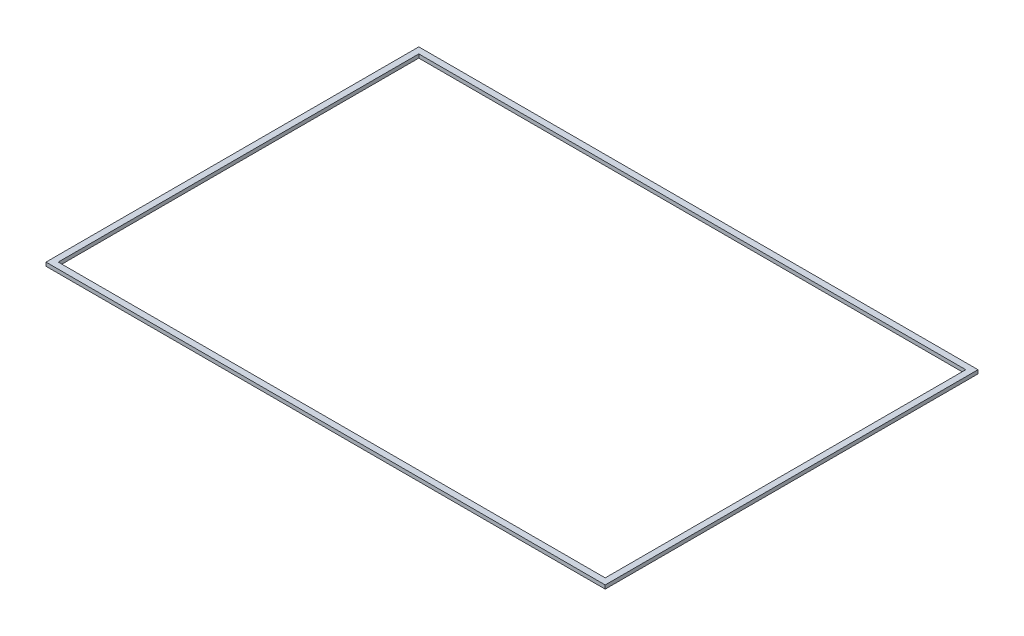
ISO-10303-21;
HEADER;
FILE_DESCRIPTION(('STEP AP214'),'2;1');
FILE_NAME('part.step','',(''),(''),'','','');
FILE_SCHEMA(('AUTOMOTIVE_DESIGN { 1 0 10303 214 1 1 1 1 }'));
ENDSEC;
DATA;
#1=APPLICATION_CONTEXT('core data for automotive mechanical design processes');
#2=APPLICATION_PROTOCOL_DEFINITION('international standard','automotive_design',2000,#1);
#3=PRODUCT_CONTEXT('',#1,'mechanical');
#4=PRODUCT('Part','Part','',(#3));
#5=PRODUCT_RELATED_PRODUCT_CATEGORY('part','',(#4));
#6=PRODUCT_DEFINITION_FORMATION('','',#4);
#7=PRODUCT_DEFINITION_CONTEXT('part definition',#1,'design');
#8=PRODUCT_DEFINITION('design','',#6,#7);
#9=PRODUCT_DEFINITION_SHAPE('','',#8);
#10=(LENGTH_UNIT() NAMED_UNIT(*) SI_UNIT(.MILLI.,.METRE.));
#11=(NAMED_UNIT(*) PLANE_ANGLE_UNIT() SI_UNIT($,.RADIAN.));
#12=(NAMED_UNIT(*) SI_UNIT($,.STERADIAN.) SOLID_ANGLE_UNIT());
#13=UNCERTAINTY_MEASURE_WITH_UNIT(LENGTH_MEASURE(1.E-05),#10,'distance_accuracy_value','');
#14=(GEOMETRIC_REPRESENTATION_CONTEXT(3) GLOBAL_UNCERTAINTY_ASSIGNED_CONTEXT((#13)) GLOBAL_UNIT_ASSIGNED_CONTEXT((#10,
#11,#12)) REPRESENTATION_CONTEXT('',''));
#15=CARTESIAN_POINT('',(0.,0.,0.));
#16=DIRECTION('',(0.,0.,1.));
#17=DIRECTION('',(1.,0.,0.));
#18=AXIS2_PLACEMENT_3D('',#15,#16,#17);
#19=CARTESIAN_POINT('',(0.,12.,590.));
#20=DIRECTION('',(0.,0.,1.));
#21=DIRECTION('',(1.,0.,0.));
#22=AXIS2_PLACEMENT_3D('',#19,#20,#21);
#23=PLANE('',#22);
#24=DIRECTION('',(-1.,0.,0.));
#25=VECTOR('',#24,1.);
#26=CARTESIAN_POINT('',(0.,0.,590.));
#27=LINE('',#26,#25);
#28=CARTESIAN_POINT('',(895.,0.,590.));
#29=VERTEX_POINT('',#28);
#30=CARTESIAN_POINT('',(-895.,0.,590.));
#31=VERTEX_POINT('',#30);
#32=EDGE_CURVE('E142',#29,#31,#27,.T.);
#33=ORIENTED_EDGE('',*,*,#32,.T.);
#34=DIRECTION('',(0.,-1.,0.));
#35=VECTOR('',#34,1.);
#36=CARTESIAN_POINT('',(-895.,12.,590.));
#37=LINE('',#36,#35);
#38=CARTESIAN_POINT('',(-895.,12.,590.));
#39=VERTEX_POINT('',#38);
#40=EDGE_CURVE('E11',#39,#31,#37,.T.);
#41=ORIENTED_EDGE('',*,*,#40,.F.);
#42=DIRECTION('',(-1.,0.,0.));
#43=VECTOR('',#42,1.);
#44=CARTESIAN_POINT('',(0.,12.,590.));
#45=LINE('',#44,#43);
#46=CARTESIAN_POINT('',(895.,12.,590.));
#47=VERTEX_POINT('',#46);
#48=EDGE_CURVE('E119',#47,#39,#45,.T.);
#49=ORIENTED_EDGE('',*,*,#48,.F.);
#50=DIRECTION('',(0.,-1.,0.));
#51=VECTOR('',#50,1.);
#52=CARTESIAN_POINT('',(895.,12.,590.));
#53=LINE('',#52,#51);
#54=EDGE_CURVE('E149',#47,#29,#53,.T.);
#55=ORIENTED_EDGE('',*,*,#54,.T.);
#56=EDGE_LOOP('',(#33,#41,#49,#55));
#57=FACE_BOUND('',#56,.T.);
#58=ADVANCED_FACE('F37',(#57),#23,.F.);
#59=CARTESIAN_POINT('',(-895.000000000001,12.,-6.85275591061735E-13));
#60=DIRECTION('',(-1.,0.,0.));
#61=DIRECTION('',(0.,0.,1.));
#62=AXIS2_PLACEMENT_3D('',#59,#60,#61);
#63=PLANE('',#62);
#64=DIRECTION('',(0.,0.,-1.));
#65=VECTOR('',#64,1.);
#66=CARTESIAN_POINT('',(-895.000000000001,0.,-6.85275591061735E-13));
#67=LINE('',#66,#65);
#68=CARTESIAN_POINT('',(-895.,0.,-590.));
#69=VERTEX_POINT('',#68);
#70=EDGE_CURVE('E124',#31,#69,#67,.T.);
#71=ORIENTED_EDGE('',*,*,#70,.T.);
#72=DIRECTION('',(0.,-1.,0.));
#73=VECTOR('',#72,1.);
#74=CARTESIAN_POINT('',(-895.,12.,-590.));
#75=LINE('',#74,#73);
#76=CARTESIAN_POINT('',(-895.,12.,-590.));
#77=VERTEX_POINT('',#76);
#78=EDGE_CURVE('E47',#77,#69,#75,.T.);
#79=ORIENTED_EDGE('',*,*,#78,.F.);
#80=DIRECTION('',(0.,0.,-1.));
#81=VECTOR('',#80,1.);
#82=CARTESIAN_POINT('',(-895.000000000001,12.,-6.85275591061735E-13));
#83=LINE('',#82,#81);
#84=EDGE_CURVE('E113',#39,#77,#83,.T.);
#85=ORIENTED_EDGE('',*,*,#84,.F.);
#86=ORIENTED_EDGE('',*,*,#40,.T.);
#87=EDGE_LOOP('',(#71,#79,#85,#86));
#88=FACE_BOUND('',#87,.T.);
#89=ADVANCED_FACE('F123',(#88),#63,.F.);
#90=CARTESIAN_POINT('',(0.,12.,-590.));
#91=DIRECTION('',(0.,0.,-1.));
#92=DIRECTION('',(-1.,0.,0.));
#93=AXIS2_PLACEMENT_3D('',#90,#91,#92);
#94=PLANE('',#93);
#95=DIRECTION('',(1.,0.,0.));
#96=VECTOR('',#95,1.);
#97=CARTESIAN_POINT('',(0.,0.,-590.));
#98=LINE('',#97,#96);
#99=CARTESIAN_POINT('',(895.,0.,-590.));
#100=VERTEX_POINT('',#99);
#101=EDGE_CURVE('E85',#69,#100,#98,.T.);
#102=ORIENTED_EDGE('',*,*,#101,.T.);
#103=DIRECTION('',(0.,-1.,0.));
#104=VECTOR('',#103,1.);
#105=CARTESIAN_POINT('',(895.,12.,-590.));
#106=LINE('',#105,#104);
#107=CARTESIAN_POINT('',(895.,12.,-590.));
#108=VERTEX_POINT('',#107);
#109=EDGE_CURVE('E125',#108,#100,#106,.T.);
#110=ORIENTED_EDGE('',*,*,#109,.F.);
#111=DIRECTION('',(1.,0.,0.));
#112=VECTOR('',#111,1.);
#113=CARTESIAN_POINT('',(0.,12.,-590.));
#114=LINE('',#113,#112);
#115=EDGE_CURVE('E117',#77,#108,#114,.T.);
#116=ORIENTED_EDGE('',*,*,#115,.F.);
#117=ORIENTED_EDGE('',*,*,#78,.T.);
#118=EDGE_LOOP('',(#102,#110,#116,#117));
#119=FACE_BOUND('',#118,.T.);
#120=ADVANCED_FACE('F127',(#119),#94,.F.);
#121=CARTESIAN_POINT('',(-915.,12.,0.));
#122=DIRECTION('',(1.,0.,0.));
#123=DIRECTION('',(0.,0.,-1.));
#124=AXIS2_PLACEMENT_3D('',#121,#122,#123);
#125=PLANE('',#124);
#126=DIRECTION('',(0.,0.,1.));
#127=VECTOR('',#126,1.);
#128=CARTESIAN_POINT('',(-915.,0.,0.));
#129=LINE('',#128,#127);
#130=CARTESIAN_POINT('',(-915.,0.,-610.));
#131=VERTEX_POINT('',#130);
#132=CARTESIAN_POINT('',(-915.,0.,610.));
#133=VERTEX_POINT('',#132);
#134=EDGE_CURVE('E133',#131,#133,#129,.T.);
#135=ORIENTED_EDGE('',*,*,#134,.T.);
#136=DIRECTION('',(0.,-1.,0.));
#137=VECTOR('',#136,1.);
#138=CARTESIAN_POINT('',(-915.,12.,610.));
#139=LINE('',#138,#137);
#140=CARTESIAN_POINT('',(-915.,12.,610.));
#141=VERTEX_POINT('',#140);
#142=EDGE_CURVE('E41',#141,#133,#139,.T.);
#143=ORIENTED_EDGE('',*,*,#142,.F.);
#144=DIRECTION('',(0.,0.,1.));
#145=VECTOR('',#144,1.);
#146=CARTESIAN_POINT('',(-915.,12.,0.));
#147=LINE('',#146,#145);
#148=CARTESIAN_POINT('',(-915.,12.,-610.));
#149=VERTEX_POINT('',#148);
#150=EDGE_CURVE('E148',#149,#141,#147,.T.);
#151=ORIENTED_EDGE('',*,*,#150,.F.);
#152=DIRECTION('',(0.,-1.,0.));
#153=VECTOR('',#152,1.);
#154=CARTESIAN_POINT('',(-915.,12.,-610.));
#155=LINE('',#154,#153);
#156=EDGE_CURVE('E129',#149,#131,#155,.T.);
#157=ORIENTED_EDGE('',*,*,#156,.T.);
#158=EDGE_LOOP('',(#135,#143,#151,#157));
#159=FACE_BOUND('',#158,.T.);
#160=ADVANCED_FACE('F39',(#159),#125,.F.);
#161=CARTESIAN_POINT('',(1.11022302462516E-13,12.,610.));
#162=DIRECTION('',(0.,0.,-1.));
#163=DIRECTION('',(-1.,0.,0.));
#164=AXIS2_PLACEMENT_3D('',#161,#162,#163);
#165=PLANE('',#164);
#166=DIRECTION('',(1.,0.,0.));
#167=VECTOR('',#166,1.);
#168=CARTESIAN_POINT('',(1.11022302462516E-13,0.,610.));
#169=LINE('',#168,#167);
#170=CARTESIAN_POINT('',(915.,0.,610.));
#171=VERTEX_POINT('',#170);
#172=EDGE_CURVE('E136',#133,#171,#169,.T.);
#173=ORIENTED_EDGE('',*,*,#172,.T.);
#174=DIRECTION('',(0.,-1.,0.));
#175=VECTOR('',#174,1.);
#176=CARTESIAN_POINT('',(915.,12.,610.));
#177=LINE('',#176,#175);
#178=CARTESIAN_POINT('',(915.,12.,610.));
#179=VERTEX_POINT('',#178);
#180=EDGE_CURVE('E156',#179,#171,#177,.T.);
#181=ORIENTED_EDGE('',*,*,#180,.F.);
#182=DIRECTION('',(1.,0.,0.));
#183=VECTOR('',#182,1.);
#184=CARTESIAN_POINT('',(1.11022302462516E-13,12.,610.));
#185=LINE('',#184,#183);
#186=EDGE_CURVE('E100',#141,#179,#185,.T.);
#187=ORIENTED_EDGE('',*,*,#186,.F.);
#188=ORIENTED_EDGE('',*,*,#142,.T.);
#189=EDGE_LOOP('',(#173,#181,#187,#188));
#190=FACE_BOUND('',#189,.T.);
#191=ADVANCED_FACE('F162',(#190),#165,.F.);
#192=CARTESIAN_POINT('',(915.,12.,-3.276948604942E-13));
#193=DIRECTION('',(-1.,0.,0.));
#194=DIRECTION('',(0.,0.,1.));
#195=AXIS2_PLACEMENT_3D('',#192,#193,#194);
#196=PLANE('',#195);
#197=DIRECTION('',(0.,0.,-1.));
#198=VECTOR('',#197,1.);
#199=CARTESIAN_POINT('',(915.,0.,-3.276948604942E-13));
#200=LINE('',#199,#198);
#201=CARTESIAN_POINT('',(915.,0.,-610.));
#202=VERTEX_POINT('',#201);
#203=EDGE_CURVE('E138',#171,#202,#200,.T.);
#204=ORIENTED_EDGE('',*,*,#203,.T.);
#205=DIRECTION('',(0.,-1.,0.));
#206=VECTOR('',#205,1.);
#207=CARTESIAN_POINT('',(915.,12.,-610.));
#208=LINE('',#207,#206);
#209=CARTESIAN_POINT('',(915.,12.,-610.));
#210=VERTEX_POINT('',#209);
#211=EDGE_CURVE('E154',#210,#202,#208,.T.);
#212=ORIENTED_EDGE('',*,*,#211,.F.);
#213=DIRECTION('',(0.,0.,-1.));
#214=VECTOR('',#213,1.);
#215=CARTESIAN_POINT('',(915.,12.,-3.276948604942E-13));
#216=LINE('',#215,#214);
#217=EDGE_CURVE('E178',#179,#210,#216,.T.);
#218=ORIENTED_EDGE('',*,*,#217,.F.);
#219=ORIENTED_EDGE('',*,*,#180,.T.);
#220=EDGE_LOOP('',(#204,#212,#218,#219));
#221=FACE_BOUND('',#220,.T.);
#222=ADVANCED_FACE('F172',(#221),#196,.F.);
#223=CARTESIAN_POINT('',(-1.11022302462516E-13,12.,-610.));
#224=DIRECTION('',(0.,0.,1.));
#225=DIRECTION('',(1.,0.,0.));
#226=AXIS2_PLACEMENT_3D('',#223,#224,#225);
#227=PLANE('',#226);
#228=DIRECTION('',(-1.,0.,0.));
#229=VECTOR('',#228,1.);
#230=CARTESIAN_POINT('',(-1.11022302462516E-13,0.,-610.));
#231=LINE('',#230,#229);
#232=EDGE_CURVE('E140',#202,#131,#231,.T.);
#233=ORIENTED_EDGE('',*,*,#232,.T.);
#234=ORIENTED_EDGE('',*,*,#156,.F.);
#235=DIRECTION('',(-1.,0.,0.));
#236=VECTOR('',#235,1.);
#237=CARTESIAN_POINT('',(-1.11022302462516E-13,12.,-610.));
#238=LINE('',#237,#236);
#239=EDGE_CURVE('E176',#210,#149,#238,.T.);
#240=ORIENTED_EDGE('',*,*,#239,.F.);
#241=ORIENTED_EDGE('',*,*,#211,.T.);
#242=EDGE_LOOP('',(#233,#234,#240,#241));
#243=FACE_BOUND('',#242,.T.);
#244=ADVANCED_FACE('F175',(#243),#227,.F.);
#245=CARTESIAN_POINT('',(895.,12.,-3.42637795530868E-13));
#246=DIRECTION('',(1.,0.,0.));
#247=DIRECTION('',(0.,0.,-1.));
#248=AXIS2_PLACEMENT_3D('',#245,#246,#247);
#249=PLANE('',#248);
#250=DIRECTION('',(0.,0.,1.));
#251=VECTOR('',#250,1.);
#252=CARTESIAN_POINT('',(895.,0.,-3.42637795530868E-13));
#253=LINE('',#252,#251);
#254=EDGE_CURVE('E91',#100,#29,#253,.T.);
#255=ORIENTED_EDGE('',*,*,#254,.T.);
#256=ORIENTED_EDGE('',*,*,#54,.F.);
#257=DIRECTION('',(0.,0.,1.));
#258=VECTOR('',#257,1.);
#259=CARTESIAN_POINT('',(895.,12.,-3.42637795530868E-13));
#260=LINE('',#259,#258);
#261=EDGE_CURVE('E56',#108,#47,#260,.T.);
#262=ORIENTED_EDGE('',*,*,#261,.F.);
#263=ORIENTED_EDGE('',*,*,#109,.T.);
#264=EDGE_LOOP('',(#255,#256,#262,#263));
#265=FACE_BOUND('',#264,.T.);
#266=ADVANCED_FACE('F184',(#265),#249,.F.);
#267=CARTESIAN_POINT('',(0.,12.,0.));
#268=DIRECTION('',(0.,1.,0.));
#269=DIRECTION('',(0.,0.,1.));
#270=AXIS2_PLACEMENT_3D('',#267,#268,#269);
#271=PLANE('',#270);
#272=ORIENTED_EDGE('',*,*,#150,.T.);
#273=ORIENTED_EDGE('',*,*,#186,.T.);
#274=ORIENTED_EDGE('',*,*,#217,.T.);
#275=ORIENTED_EDGE('',*,*,#239,.T.);
#276=EDGE_LOOP('',(#272,#273,#274,#275));
#277=FACE_BOUND('',#276,.T.);
#278=ORIENTED_EDGE('',*,*,#48,.T.);
#279=ORIENTED_EDGE('',*,*,#84,.T.);
#280=ORIENTED_EDGE('',*,*,#115,.T.);
#281=ORIENTED_EDGE('',*,*,#261,.T.);
#282=EDGE_LOOP('',(#278,#279,#280,#281));
#283=FACE_BOUND('',#282,.T.);
#284=ADVANCED_FACE('F115',(#277,#283),#271,.T.);
#285=CARTESIAN_POINT('',(0.,0.,0.));
#286=DIRECTION('',(0.,1.,0.));
#287=DIRECTION('',(0.,0.,1.));
#288=AXIS2_PLACEMENT_3D('',#285,#286,#287);
#289=PLANE('',#288);
#290=ORIENTED_EDGE('',*,*,#134,.F.);
#291=ORIENTED_EDGE('',*,*,#232,.F.);
#292=ORIENTED_EDGE('',*,*,#203,.F.);
#293=ORIENTED_EDGE('',*,*,#172,.F.);
#294=EDGE_LOOP('',(#290,#291,#292,#293));
#295=FACE_BOUND('',#294,.T.);
#296=ORIENTED_EDGE('',*,*,#32,.F.);
#297=ORIENTED_EDGE('',*,*,#254,.F.);
#298=ORIENTED_EDGE('',*,*,#101,.F.);
#299=ORIENTED_EDGE('',*,*,#70,.F.);
#300=EDGE_LOOP('',(#296,#297,#298,#299));
#301=FACE_BOUND('',#300,.T.);
#302=ADVANCED_FACE('F169',(#295,#301),#289,.F.);
#303=CLOSED_SHELL('',(#58,#89,#120,#160,#191,#222,#244,#266,#284,#302));
#304=MANIFOLD_SOLID_BREP('B2',#303);
#305=ADVANCED_BREP_SHAPE_REPRESENTATION('',(#18,#304),#14);
#306=SHAPE_DEFINITION_REPRESENTATION(#9,#305);
ENDSEC;
END-ISO-10303-21;
